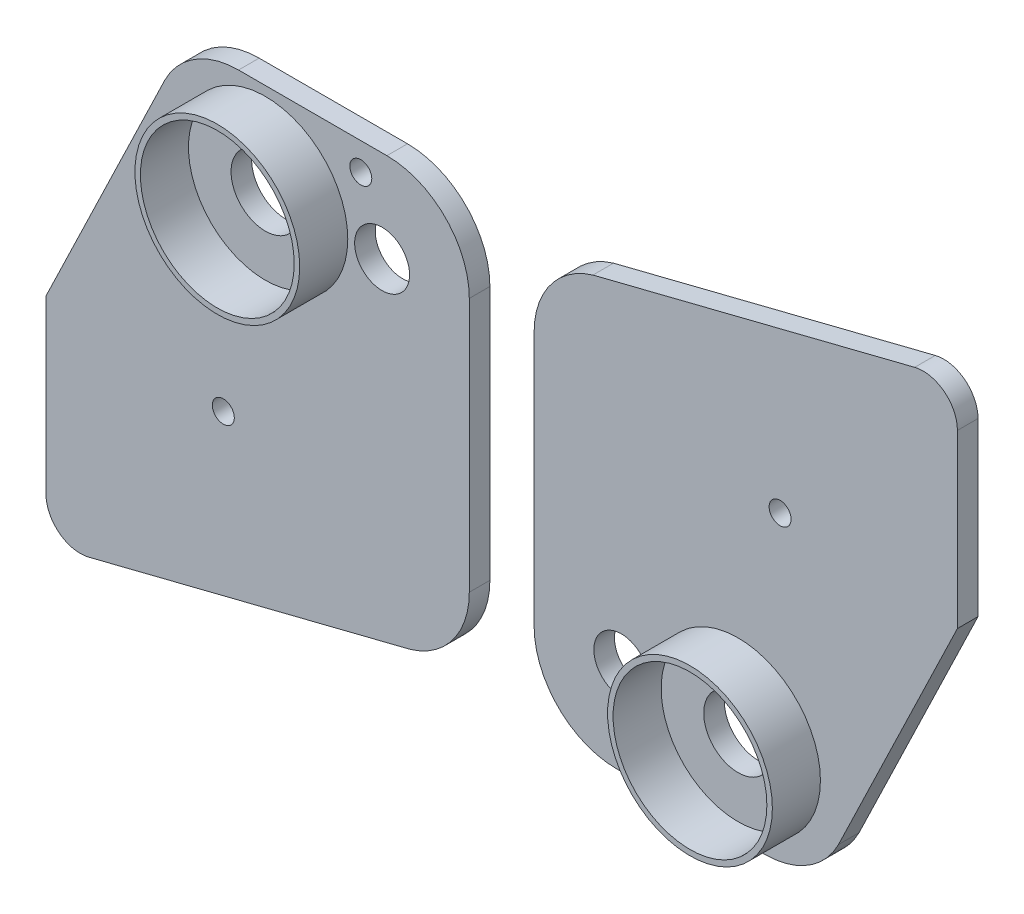
ISO-10303-21;
HEADER;
FILE_DESCRIPTION(('STEP AP214'),'2;1');
FILE_NAME('part.step','',(''),(''),'','','');
FILE_SCHEMA(('AUTOMOTIVE_DESIGN { 1 0 10303 214 1 1 1 1 }'));
ENDSEC;
DATA;
#1=APPLICATION_CONTEXT('core data for automotive mechanical design processes');
#2=APPLICATION_PROTOCOL_DEFINITION('international standard','automotive_design',2000,#1);
#3=PRODUCT_CONTEXT('',#1,'mechanical');
#4=PRODUCT('Part','Part','',(#3));
#5=PRODUCT_RELATED_PRODUCT_CATEGORY('part','',(#4));
#6=PRODUCT_DEFINITION_FORMATION('','',#4);
#7=PRODUCT_DEFINITION_CONTEXT('part definition',#1,'design');
#8=PRODUCT_DEFINITION('design','',#6,#7);
#9=PRODUCT_DEFINITION_SHAPE('','',#8);
#10=(LENGTH_UNIT() NAMED_UNIT(*) SI_UNIT(.MILLI.,.METRE.));
#11=(NAMED_UNIT(*) PLANE_ANGLE_UNIT() SI_UNIT($,.RADIAN.));
#12=(NAMED_UNIT(*) SI_UNIT($,.STERADIAN.) SOLID_ANGLE_UNIT());
#13=UNCERTAINTY_MEASURE_WITH_UNIT(LENGTH_MEASURE(1.E-05),#10,'distance_accuracy_value','');
#14=(GEOMETRIC_REPRESENTATION_CONTEXT(3) GLOBAL_UNCERTAINTY_ASSIGNED_CONTEXT((#13)) GLOBAL_UNIT_ASSIGNED_CONTEXT((#10,
#11,#12)) REPRESENTATION_CONTEXT('',''));
#15=CARTESIAN_POINT('',(0.,0.,0.));
#16=DIRECTION('',(0.,0.,1.));
#17=DIRECTION('',(1.,0.,0.));
#18=AXIS2_PLACEMENT_3D('',#15,#16,#17);
#19=CARTESIAN_POINT('',(377.739863494264,199.097061175407,3.));
#20=DIRECTION('',(0.,0.,1.));
#21=DIRECTION('',(1.,0.,0.));
#22=AXIS2_PLACEMENT_3D('',#19,#20,#21);
#23=PLANE('',#22);
#24=CARTESIAN_POINT('',(395.439813655086,163.405787794351,3.));
#25=DIRECTION('',(0.,0.,1.));
#26=DIRECTION('',(1.,0.,0.));
#27=AXIS2_PLACEMENT_3D('',#24,#25,#26);
#28=CIRCLE('',#27,5.);
#29=CARTESIAN_POINT('',(400.439813655086,163.405787794351,3.));
#30=VERTEX_POINT('',#29);
#31=EDGE_CURVE('E165',#30,#30,#28,.T.);
#32=ORIENTED_EDGE('',*,*,#31,.F.);
#33=EDGE_LOOP('',(#32));
#34=FACE_BOUND('',#33,.T.);
#35=CARTESIAN_POINT('',(395.439813655086,163.405787794351,3.));
#36=DIRECTION('',(0.,0.,1.));
#37=DIRECTION('',(1.,0.,0.));
#38=AXIS2_PLACEMENT_3D('',#35,#36,#37);
#39=CIRCLE('',#38,11.2);
#40=CARTESIAN_POINT('',(406.639813655086,163.405787794351,3.));
#41=VERTEX_POINT('',#40);
#42=EDGE_CURVE('E12',#41,#41,#39,.F.);
#43=ORIENTED_EDGE('',*,*,#42,.F.);
#44=EDGE_LOOP('',(#43));
#45=FACE_BOUND('',#44,.T.);
#46=ADVANCED_FACE('F49',(#34,#45),#23,.T.);
#47=CARTESIAN_POINT('',(381.543175650086,154.035452128009,3.));
#48=DIRECTION('',(0.,0.,1.));
#49=DIRECTION('',(1.,0.,0.));
#50=AXIS2_PLACEMENT_3D('',#47,#48,#49);
#51=CIRCLE('',#50,1.59999999999996);
#52=CARTESIAN_POINT('',(383.143175650086,154.035452128009,3.));
#53=VERTEX_POINT('',#52);
#54=EDGE_CURVE('E411',#53,#53,#51,.T.);
#55=ORIENTED_EDGE('',*,*,#54,.F.);
#56=EDGE_LOOP('',(#55));
#57=FACE_BOUND('',#56,.T.);
#58=CARTESIAN_POINT('',(395.439813655086,163.405787794351,3.));
#59=DIRECTION('',(0.,0.,1.));
#60=DIRECTION('',(1.,0.,0.));
#61=AXIS2_PLACEMENT_3D('',#58,#59,#60);
#62=CIRCLE('',#61,12.);
#63=CARTESIAN_POINT('',(407.439813655086,163.405787794351,3.));
#64=VERTEX_POINT('',#63);
#65=EDGE_CURVE('E416',#64,#64,#62,.T.);
#66=ORIENTED_EDGE('',*,*,#65,.F.);
#67=EDGE_LOOP('',(#66));
#68=FACE_BOUND('',#67,.T.);
#69=CARTESIAN_POINT('',(378.439815150086,163.409889395351,3.));
#70=DIRECTION('',(0.,0.,1.));
#71=DIRECTION('',(1.,0.,0.));
#72=AXIS2_PLACEMENT_3D('',#69,#70,#71);
#73=CIRCLE('',#72,4.);
#74=CARTESIAN_POINT('',(382.439815150086,163.409889395351,3.));
#75=VERTEX_POINT('',#74);
#76=EDGE_CURVE('E432',#75,#75,#73,.T.);
#77=ORIENTED_EDGE('',*,*,#76,.F.);
#78=EDGE_LOOP('',(#77));
#79=FACE_BOUND('',#78,.T.);
#80=CARTESIAN_POINT('',(377.739863494264,199.097061175407,3.));
#81=DIRECTION('',(0.,0.,1.));
#82=DIRECTION('',(1.,0.,0.));
#83=AXIS2_PLACEMENT_3D('',#80,#81,#82);
#84=CIRCLE('',#83,12.);
#85=CARTESIAN_POINT('',(374.304233938086,210.594732659352,3.));
#86=VERTEX_POINT('',#85);
#87=CARTESIAN_POINT('',(365.739863495086,199.097201598351,3.));
#88=VERTEX_POINT('',#87);
#89=EDGE_CURVE('E180',#86,#88,#84,.T.);
#90=ORIENTED_EDGE('',*,*,#89,.T.);
#91=DIRECTION('',(-1.1989243278738E-05,-0.999999999928129,0.));
#92=VECTOR('',#91,1.);
#93=CARTESIAN_POINT('',(365.739863495086,199.097201598351,3.));
#94=LINE('',#93,#92);
#95=CARTESIAN_POINT('',(365.739785625086,192.560881428352,3.));
#96=VERTEX_POINT('',#95);
#97=EDGE_CURVE('E117',#88,#96,#94,.T.);
#98=ORIENTED_EDGE('',*,*,#97,.T.);
#99=DIRECTION('',(-1.18627733119877E-05,-0.999999999929637,0.));
#100=VECTOR('',#99,1.);
#101=CARTESIAN_POINT('',(365.739785625086,192.560881428352,3.));
#102=LINE('',#101,#100);
#103=CARTESIAN_POINT('',(365.739423511086,162.035641633352,3.));
#104=VERTEX_POINT('',#103);
#105=EDGE_CURVE('E215',#96,#104,#102,.T.);
#106=ORIENTED_EDGE('',*,*,#105,.T.);
#107=CARTESIAN_POINT('',(377.739416510132,162.035490368515,3.));
#108=DIRECTION('',(0.,0.,1.));
#109=DIRECTION('',(1.,0.,0.));
#110=AXIS2_PLACEMENT_3D('',#107,#108,#109);
#111=CIRCLE('',#110,11.999993);
#112=CARTESIAN_POINT('',(377.739274869086,150.035497369351,3.));
#113=VERTEX_POINT('',#112);
#114=EDGE_CURVE('E212',#104,#113,#111,.T.);
#115=ORIENTED_EDGE('',*,*,#114,.T.);
#116=DIRECTION('',(0.999999999929273,-1.18934820438512E-05,0.));
#117=VECTOR('',#116,1.);
#118=CARTESIAN_POINT('',(377.739274869086,150.035497369351,3.));
#119=LINE('',#118,#117);
#120=CARTESIAN_POINT('',(399.347076431086,150.035240377352,3.));
#121=VERTEX_POINT('',#120);
#122=EDGE_CURVE('E214',#113,#121,#119,.T.);
#123=ORIENTED_EDGE('',*,*,#122,.T.);
#124=CARTESIAN_POINT('',(399.34721242908,162.035241376581,3.));
#125=DIRECTION('',(0.,0.,1.));
#126=DIRECTION('',(1.,0.,0.));
#127=AXIS2_PLACEMENT_3D('',#124,#125,#126);
#128=CIRCLE('',#127,12.000001);
#129=CARTESIAN_POINT('',(410.064546388086,156.637206844351,3.));
#130=VERTEX_POINT('',#129);
#131=EDGE_CURVE('E217',#121,#130,#128,.T.);
#132=ORIENTED_EDGE('',*,*,#131,.T.);
#133=DIRECTION('',(0.434503028481842,0.900670371578919,0.));
#134=VECTOR('',#133,1.);
#135=CARTESIAN_POINT('',(410.064546388086,156.637206844351,3.));
#136=LINE('',#135,#134);
#137=CARTESIAN_POINT('',(427.388642283086,192.547888391352,3.));
#138=VERTEX_POINT('',#137);
#139=EDGE_CURVE('E143',#130,#138,#136,.T.);
#140=ORIENTED_EDGE('',*,*,#139,.T.);
#141=DIRECTION('',(0.,1.,0.));
#142=VECTOR('',#141,1.);
#143=CARTESIAN_POINT('',(427.388642283086,192.547888391352,3.));
#144=LINE('',#143,#142);
#145=CARTESIAN_POINT('',(427.388642283086,217.538315941336,3.));
#146=VERTEX_POINT('',#145);
#147=EDGE_CURVE('E136',#138,#146,#144,.T.);
#148=ORIENTED_EDGE('',*,*,#147,.T.);
#149=CARTESIAN_POINT('',(422.388642283086,217.538315941336,3.));
#150=DIRECTION('',(0.,0.,1.));
#151=DIRECTION('',(1.,0.,0.));
#152=AXIS2_PLACEMENT_3D('',#149,#150,#151);
#153=CIRCLE('',#152,5.00000000000001);
#154=CARTESIAN_POINT('',(421.168529959641,222.387163837299,3.));
#155=VERTEX_POINT('',#154);
#156=EDGE_CURVE('E141',#146,#155,#153,.T.);
#157=ORIENTED_EDGE('',*,*,#156,.T.);
#158=DIRECTION('',(-0.969769579192457,-0.244022464688982,0.));
#159=VECTOR('',#158,1.);
#160=CARTESIAN_POINT('',(421.168529959641,222.387163837299,3.));
#161=LINE('',#160,#159);
#162=EDGE_CURVE('E67',#155,#86,#161,.T.);
#163=ORIENTED_EDGE('',*,*,#162,.T.);
#164=EDGE_LOOP('',(#90,#98,#106,#115,#123,#132,#140,#148,#157,#163));
#165=FACE_BOUND('',#164,.T.);
#166=CARTESIAN_POINT('',(401.564798043086,194.210214669352,3.));
#167=DIRECTION('',(0.,0.,1.));
#168=DIRECTION('',(1.,0.,0.));
#169=AXIS2_PLACEMENT_3D('',#166,#167,#168);
#170=CIRCLE('',#169,1.59999999999999);
#171=CARTESIAN_POINT('',(403.164798043086,194.210214669352,3.));
#172=VERTEX_POINT('',#171);
#173=EDGE_CURVE('E426',#172,#172,#170,.T.);
#174=ORIENTED_EDGE('',*,*,#173,.F.);
#175=EDGE_LOOP('',(#174));
#176=FACE_BOUND('',#175,.T.);
#177=ADVANCED_FACE('F138',(#57,#68,#79,#165,#176),#23,.T.);
#178=CARTESIAN_POINT('',(377.739863494264,199.097061175407,0.));
#179=DIRECTION('',(0.,0.,1.));
#180=DIRECTION('',(1.,0.,0.));
#181=AXIS2_PLACEMENT_3D('',#178,#179,#180);
#182=PLANE('',#181);
#183=CARTESIAN_POINT('',(381.543175650086,154.035452128009,0.));
#184=DIRECTION('',(0.,0.,1.));
#185=DIRECTION('',(1.,0.,0.));
#186=AXIS2_PLACEMENT_3D('',#183,#184,#185);
#187=CIRCLE('',#186,1.59999999999996);
#188=CARTESIAN_POINT('',(383.143175650086,154.035452128009,0.));
#189=VERTEX_POINT('',#188);
#190=EDGE_CURVE('E53',#189,#189,#187,.T.);
#191=ORIENTED_EDGE('',*,*,#190,.T.);
#192=EDGE_LOOP('',(#191));
#193=FACE_BOUND('',#192,.T.);
#194=CARTESIAN_POINT('',(377.739863494264,199.097061175407,0.));
#195=DIRECTION('',(0.,0.,1.));
#196=DIRECTION('',(1.,0.,0.));
#197=AXIS2_PLACEMENT_3D('',#194,#195,#196);
#198=CIRCLE('',#197,12.);
#199=CARTESIAN_POINT('',(374.304233938086,210.594732659352,0.));
#200=VERTEX_POINT('',#199);
#201=CARTESIAN_POINT('',(365.739863495086,199.097201598351,0.));
#202=VERTEX_POINT('',#201);
#203=EDGE_CURVE('E161',#200,#202,#198,.T.);
#204=ORIENTED_EDGE('',*,*,#203,.F.);
#205=DIRECTION('',(-0.969769579192457,-0.244022464688982,0.));
#206=VECTOR('',#205,1.);
#207=CARTESIAN_POINT('',(421.168529959641,222.387163837299,0.));
#208=LINE('',#207,#206);
#209=CARTESIAN_POINT('',(421.168529959641,222.387163837299,0.));
#210=VERTEX_POINT('',#209);
#211=EDGE_CURVE('E108',#210,#200,#208,.T.);
#212=ORIENTED_EDGE('',*,*,#211,.F.);
#213=CARTESIAN_POINT('',(422.388642283086,217.538315941336,0.));
#214=DIRECTION('',(0.,0.,1.));
#215=DIRECTION('',(1.,0.,0.));
#216=AXIS2_PLACEMENT_3D('',#213,#214,#215);
#217=CIRCLE('',#216,5.00000000000001);
#218=CARTESIAN_POINT('',(427.388642283086,217.538315941336,0.));
#219=VERTEX_POINT('',#218);
#220=EDGE_CURVE('E102',#219,#210,#217,.T.);
#221=ORIENTED_EDGE('',*,*,#220,.F.);
#222=DIRECTION('',(0.,1.,0.));
#223=VECTOR('',#222,1.);
#224=CARTESIAN_POINT('',(427.388642283086,192.547888391352,0.));
#225=LINE('',#224,#223);
#226=CARTESIAN_POINT('',(427.388642283086,192.547888391352,0.));
#227=VERTEX_POINT('',#226);
#228=EDGE_CURVE('E151',#227,#219,#225,.T.);
#229=ORIENTED_EDGE('',*,*,#228,.F.);
#230=DIRECTION('',(0.434503028481842,0.900670371578919,0.));
#231=VECTOR('',#230,1.);
#232=CARTESIAN_POINT('',(410.064546388086,156.637206844351,0.));
#233=LINE('',#232,#231);
#234=CARTESIAN_POINT('',(410.064546388086,156.637206844351,0.));
#235=VERTEX_POINT('',#234);
#236=EDGE_CURVE('E175',#235,#227,#233,.T.);
#237=ORIENTED_EDGE('',*,*,#236,.F.);
#238=CARTESIAN_POINT('',(399.34721242908,162.035241376581,0.));
#239=DIRECTION('',(0.,0.,1.));
#240=DIRECTION('',(1.,0.,0.));
#241=AXIS2_PLACEMENT_3D('',#238,#239,#240);
#242=CIRCLE('',#241,12.000001);
#243=CARTESIAN_POINT('',(399.347076431086,150.035240377352,0.));
#244=VERTEX_POINT('',#243);
#245=EDGE_CURVE('E173',#244,#235,#242,.T.);
#246=ORIENTED_EDGE('',*,*,#245,.F.);
#247=DIRECTION('',(0.999999999929273,-1.18934820438512E-05,0.));
#248=VECTOR('',#247,1.);
#249=CARTESIAN_POINT('',(377.739274869086,150.035497369351,0.));
#250=LINE('',#249,#248);
#251=CARTESIAN_POINT('',(377.739274869086,150.035497369351,0.));
#252=VERTEX_POINT('',#251);
#253=EDGE_CURVE('E171',#252,#244,#250,.T.);
#254=ORIENTED_EDGE('',*,*,#253,.F.);
#255=CARTESIAN_POINT('',(377.739416510132,162.035490368515,0.));
#256=DIRECTION('',(0.,0.,1.));
#257=DIRECTION('',(1.,0.,0.));
#258=AXIS2_PLACEMENT_3D('',#255,#256,#257);
#259=CIRCLE('',#258,11.999993);
#260=CARTESIAN_POINT('',(365.739423511086,162.035641633352,0.));
#261=VERTEX_POINT('',#260);
#262=EDGE_CURVE('E169',#261,#252,#259,.T.);
#263=ORIENTED_EDGE('',*,*,#262,.F.);
#264=DIRECTION('',(-1.18627733119877E-05,-0.999999999929637,0.));
#265=VECTOR('',#264,1.);
#266=CARTESIAN_POINT('',(365.739785625086,192.560881428352,0.));
#267=LINE('',#266,#265);
#268=CARTESIAN_POINT('',(365.739785625086,192.560881428352,0.));
#269=VERTEX_POINT('',#268);
#270=EDGE_CURVE('E167',#269,#261,#267,.T.);
#271=ORIENTED_EDGE('',*,*,#270,.F.);
#272=DIRECTION('',(-1.18390781991546E-05,-0.999999999929918,0.));
#273=VECTOR('',#272,1.);
#274=CARTESIAN_POINT('',(365.739824693086,195.860800514351,0.));
#275=LINE('',#274,#273);
#276=EDGE_CURVE('E164',#202,#269,#275,.T.);
#277=ORIENTED_EDGE('',*,*,#276,.F.);
#278=EDGE_LOOP('',(#204,#212,#221,#229,#237,#246,#254,#263,#271,#277));
#279=FACE_BOUND('',#278,.T.);
#280=CARTESIAN_POINT('',(395.439813655086,163.405787794351,0.));
#281=DIRECTION('',(0.,0.,1.));
#282=DIRECTION('',(1.,0.,0.));
#283=AXIS2_PLACEMENT_3D('',#280,#281,#282);
#284=CIRCLE('',#283,5.);
#285=CARTESIAN_POINT('',(400.439813655086,163.405787794351,0.));
#286=VERTEX_POINT('',#285);
#287=EDGE_CURVE('E435',#286,#286,#284,.T.);
#288=ORIENTED_EDGE('',*,*,#287,.T.);
#289=EDGE_LOOP('',(#288));
#290=FACE_BOUND('',#289,.T.);
#291=CARTESIAN_POINT('',(378.439815150086,163.409889395351,0.));
#292=DIRECTION('',(0.,0.,1.));
#293=DIRECTION('',(1.,0.,0.));
#294=AXIS2_PLACEMENT_3D('',#291,#292,#293);
#295=CIRCLE('',#294,4.);
#296=CARTESIAN_POINT('',(382.439815150086,163.409889395351,0.));
#297=VERTEX_POINT('',#296);
#298=EDGE_CURVE('E429',#297,#297,#295,.T.);
#299=ORIENTED_EDGE('',*,*,#298,.T.);
#300=EDGE_LOOP('',(#299));
#301=FACE_BOUND('',#300,.T.);
#302=CARTESIAN_POINT('',(401.564798043086,194.210214669352,0.));
#303=DIRECTION('',(0.,0.,1.));
#304=DIRECTION('',(1.,0.,0.));
#305=AXIS2_PLACEMENT_3D('',#302,#303,#304);
#306=CIRCLE('',#305,1.59999999999999);
#307=CARTESIAN_POINT('',(403.164798043086,194.210214669352,0.));
#308=VERTEX_POINT('',#307);
#309=EDGE_CURVE('E423',#308,#308,#306,.T.);
#310=ORIENTED_EDGE('',*,*,#309,.T.);
#311=EDGE_LOOP('',(#310));
#312=FACE_BOUND('',#311,.T.);
#313=ADVANCED_FACE('F203',(#193,#279,#290,#301,#312),#182,.F.);
#314=CARTESIAN_POINT('',(377.739863494264,199.097061175407,3.));
#315=DIRECTION('',(0.,0.,-1.));
#316=DIRECTION('',(-1.,0.,0.));
#317=AXIS2_PLACEMENT_3D('',#314,#315,#316);
#318=CYLINDRICAL_SURFACE('',#317,12.);
#319=ORIENTED_EDGE('',*,*,#203,.T.);
#320=DIRECTION('',(0.,0.,-1.));
#321=VECTOR('',#320,1.);
#322=CARTESIAN_POINT('',(365.739863495086,199.097201598351,3.));
#323=LINE('',#322,#321);
#324=EDGE_CURVE('E59',#88,#202,#323,.T.);
#325=ORIENTED_EDGE('',*,*,#324,.F.);
#326=ORIENTED_EDGE('',*,*,#89,.F.);
#327=DIRECTION('',(0.,0.,-1.));
#328=VECTOR('',#327,1.);
#329=CARTESIAN_POINT('',(374.304233938086,210.594732659352,3.));
#330=LINE('',#329,#328);
#331=EDGE_CURVE('E157',#86,#200,#330,.T.);
#332=ORIENTED_EDGE('',*,*,#331,.T.);
#333=EDGE_LOOP('',(#319,#325,#326,#332));
#334=FACE_BOUND('',#333,.T.);
#335=ADVANCED_FACE('F51',(#334),#318,.T.);
#336=CARTESIAN_POINT('',(365.739785625086,192.560881428352,3.));
#337=DIRECTION('',(0.999999999929637,-1.18627733119877E-05,0.));
#338=DIRECTION('',(1.18627733119877E-05,0.999999999929637,0.));
#339=AXIS2_PLACEMENT_3D('',#336,#337,#338);
#340=PLANE('',#339);
#341=ORIENTED_EDGE('',*,*,#270,.T.);
#342=DIRECTION('',(0.,0.,-1.));
#343=VECTOR('',#342,1.);
#344=CARTESIAN_POINT('',(365.739423511086,162.035641633352,3.));
#345=LINE('',#344,#343);
#346=EDGE_CURVE('E193',#104,#261,#345,.T.);
#347=ORIENTED_EDGE('',*,*,#346,.F.);
#348=ORIENTED_EDGE('',*,*,#105,.F.);
#349=ORIENTED_EDGE('',*,*,#97,.F.);
#350=ORIENTED_EDGE('',*,*,#324,.T.);
#351=ORIENTED_EDGE('',*,*,#276,.T.);
#352=EDGE_LOOP('',(#341,#347,#348,#349,#350,#351));
#353=FACE_BOUND('',#352,.T.);
#354=ADVANCED_FACE('F197',(#353),#340,.F.);
#355=CARTESIAN_POINT('',(377.739416510132,162.035490368515,3.));
#356=DIRECTION('',(0.,0.,-1.));
#357=DIRECTION('',(-1.,0.,0.));
#358=AXIS2_PLACEMENT_3D('',#355,#356,#357);
#359=CYLINDRICAL_SURFACE('',#358,11.999993);
#360=ORIENTED_EDGE('',*,*,#262,.T.);
#361=DIRECTION('',(0.,0.,-1.));
#362=VECTOR('',#361,1.);
#363=CARTESIAN_POINT('',(377.739274869086,150.035497369351,3.));
#364=LINE('',#363,#362);
#365=EDGE_CURVE('E190',#113,#252,#364,.T.);
#366=ORIENTED_EDGE('',*,*,#365,.F.);
#367=ORIENTED_EDGE('',*,*,#114,.F.);
#368=ORIENTED_EDGE('',*,*,#346,.T.);
#369=EDGE_LOOP('',(#360,#366,#367,#368));
#370=FACE_BOUND('',#369,.T.);
#371=ADVANCED_FACE('F210',(#370),#359,.T.);
#372=CARTESIAN_POINT('',(377.739274869086,150.035497369351,3.));
#373=DIRECTION('',(1.18934820438512E-05,0.999999999929272,0.));
#374=DIRECTION('',(-0.999999999929273,1.18934820438512E-05,0.));
#375=AXIS2_PLACEMENT_3D('',#372,#373,#374);
#376=PLANE('',#375);
#377=ORIENTED_EDGE('',*,*,#253,.T.);
#378=DIRECTION('',(0.,0.,-1.));
#379=VECTOR('',#378,1.);
#380=CARTESIAN_POINT('',(399.347076431086,150.035240377352,3.));
#381=LINE('',#380,#379);
#382=EDGE_CURVE('E187',#121,#244,#381,.T.);
#383=ORIENTED_EDGE('',*,*,#382,.F.);
#384=ORIENTED_EDGE('',*,*,#122,.F.);
#385=ORIENTED_EDGE('',*,*,#365,.T.);
#386=EDGE_LOOP('',(#377,#383,#384,#385));
#387=FACE_BOUND('',#386,.T.);
#388=ADVANCED_FACE('F232',(#387),#376,.F.);
#389=CARTESIAN_POINT('',(399.34721242908,162.035241376581,3.));
#390=DIRECTION('',(0.,0.,-1.));
#391=DIRECTION('',(-1.,0.,0.));
#392=AXIS2_PLACEMENT_3D('',#389,#390,#391);
#393=CYLINDRICAL_SURFACE('',#392,12.000001);
#394=ORIENTED_EDGE('',*,*,#245,.T.);
#395=DIRECTION('',(0.,0.,-1.));
#396=VECTOR('',#395,1.);
#397=CARTESIAN_POINT('',(410.064546388086,156.637206844351,3.));
#398=LINE('',#397,#396);
#399=EDGE_CURVE('E184',#130,#235,#398,.T.);
#400=ORIENTED_EDGE('',*,*,#399,.F.);
#401=ORIENTED_EDGE('',*,*,#131,.F.);
#402=ORIENTED_EDGE('',*,*,#382,.T.);
#403=EDGE_LOOP('',(#394,#400,#401,#402));
#404=FACE_BOUND('',#403,.T.);
#405=ADVANCED_FACE('F226',(#404),#393,.T.);
#406=CARTESIAN_POINT('',(410.064546388086,156.637206844351,3.));
#407=DIRECTION('',(-0.900670371578919,0.434503028481842,0.));
#408=DIRECTION('',(-0.434503028481842,-0.900670371578919,0.));
#409=AXIS2_PLACEMENT_3D('',#406,#407,#408);
#410=PLANE('',#409);
#411=ORIENTED_EDGE('',*,*,#236,.T.);
#412=DIRECTION('',(0.,0.,-1.));
#413=VECTOR('',#412,1.);
#414=CARTESIAN_POINT('',(427.388642283086,192.547888391352,3.));
#415=LINE('',#414,#413);
#416=EDGE_CURVE('E152',#138,#227,#415,.T.);
#417=ORIENTED_EDGE('',*,*,#416,.F.);
#418=ORIENTED_EDGE('',*,*,#139,.F.);
#419=ORIENTED_EDGE('',*,*,#399,.T.);
#420=EDGE_LOOP('',(#411,#417,#418,#419));
#421=FACE_BOUND('',#420,.T.);
#422=ADVANCED_FACE('F230',(#421),#410,.F.);
#423=CARTESIAN_POINT('',(427.388642283086,192.547888391352,3.));
#424=DIRECTION('',(-1.,0.,0.));
#425=DIRECTION('',(0.,0.,1.));
#426=AXIS2_PLACEMENT_3D('',#423,#424,#425);
#427=PLANE('',#426);
#428=ORIENTED_EDGE('',*,*,#228,.T.);
#429=DIRECTION('',(0.,0.,-1.));
#430=VECTOR('',#429,1.);
#431=CARTESIAN_POINT('',(427.388642283086,217.538315941336,3.));
#432=LINE('',#431,#430);
#433=EDGE_CURVE('E148',#146,#219,#432,.T.);
#434=ORIENTED_EDGE('',*,*,#433,.F.);
#435=ORIENTED_EDGE('',*,*,#147,.F.);
#436=ORIENTED_EDGE('',*,*,#416,.T.);
#437=EDGE_LOOP('',(#428,#434,#435,#436));
#438=FACE_BOUND('',#437,.T.);
#439=ADVANCED_FACE('F149',(#438),#427,.F.);
#440=CARTESIAN_POINT('',(422.388642283086,217.538315941336,3.));
#441=DIRECTION('',(0.,0.,-1.));
#442=DIRECTION('',(-1.,0.,0.));
#443=AXIS2_PLACEMENT_3D('',#440,#441,#442);
#444=CYLINDRICAL_SURFACE('',#443,5.00000000000001);
#445=ORIENTED_EDGE('',*,*,#220,.T.);
#446=DIRECTION('',(0.,0.,-1.));
#447=VECTOR('',#446,1.);
#448=CARTESIAN_POINT('',(421.168529959641,222.387163837299,3.));
#449=LINE('',#448,#447);
#450=EDGE_CURVE('E153',#155,#210,#449,.T.);
#451=ORIENTED_EDGE('',*,*,#450,.F.);
#452=ORIENTED_EDGE('',*,*,#156,.F.);
#453=ORIENTED_EDGE('',*,*,#433,.T.);
#454=EDGE_LOOP('',(#445,#451,#452,#453));
#455=FACE_BOUND('',#454,.T.);
#456=ADVANCED_FACE('F155',(#455),#444,.T.);
#457=CARTESIAN_POINT('',(421.168529959641,222.387163837299,3.));
#458=DIRECTION('',(0.244022464688982,-0.969769579192457,0.));
#459=DIRECTION('',(0.969769579192457,0.244022464688982,0.));
#460=AXIS2_PLACEMENT_3D('',#457,#458,#459);
#461=PLANE('',#460);
#462=ORIENTED_EDGE('',*,*,#211,.T.);
#463=ORIENTED_EDGE('',*,*,#331,.F.);
#464=ORIENTED_EDGE('',*,*,#162,.F.);
#465=ORIENTED_EDGE('',*,*,#450,.T.);
#466=EDGE_LOOP('',(#462,#463,#464,#465));
#467=FACE_BOUND('',#466,.T.);
#468=ADVANCED_FACE('F257',(#467),#461,.F.);
#469=CARTESIAN_POINT('',(395.439813655086,163.405787794351,3.));
#470=DIRECTION('',(0.,0.,-1.));
#471=DIRECTION('',(-1.,0.,0.));
#472=AXIS2_PLACEMENT_3D('',#469,#470,#471);
#473=CYLINDRICAL_SURFACE('',#472,5.);
#474=ORIENTED_EDGE('',*,*,#31,.T.);
#475=EDGE_LOOP('',(#474));
#476=FACE_BOUND('',#475,.T.);
#477=ORIENTED_EDGE('',*,*,#287,.F.);
#478=EDGE_LOOP('',(#477));
#479=FACE_BOUND('',#478,.T.);
#480=ADVANCED_FACE('F252',(#476,#479),#473,.F.);
#481=CARTESIAN_POINT('',(378.439815150086,163.409889395351,3.));
#482=DIRECTION('',(0.,0.,-1.));
#483=DIRECTION('',(-1.,0.,0.));
#484=AXIS2_PLACEMENT_3D('',#481,#482,#483);
#485=CYLINDRICAL_SURFACE('',#484,4.);
#486=ORIENTED_EDGE('',*,*,#76,.T.);
#487=EDGE_LOOP('',(#486));
#488=FACE_BOUND('',#487,.T.);
#489=ORIENTED_EDGE('',*,*,#298,.F.);
#490=EDGE_LOOP('',(#489));
#491=FACE_BOUND('',#490,.T.);
#492=ADVANCED_FACE('F287',(#488,#491),#485,.F.);
#493=CARTESIAN_POINT('',(401.564798043086,194.210214669352,3.));
#494=DIRECTION('',(0.,0.,-1.));
#495=DIRECTION('',(-1.,0.,0.));
#496=AXIS2_PLACEMENT_3D('',#493,#494,#495);
#497=CYLINDRICAL_SURFACE('',#496,1.59999999999999);
#498=ORIENTED_EDGE('',*,*,#173,.T.);
#499=EDGE_LOOP('',(#498));
#500=FACE_BOUND('',#499,.T.);
#501=ORIENTED_EDGE('',*,*,#309,.F.);
#502=EDGE_LOOP('',(#501));
#503=FACE_BOUND('',#502,.T.);
#504=ADVANCED_FACE('F294',(#500,#503),#497,.F.);
#505=CARTESIAN_POINT('',(395.439813655086,163.405787794351,10.));
#506=DIRECTION('',(0.,0.,1.));
#507=DIRECTION('',(1.,0.,0.));
#508=AXIS2_PLACEMENT_3D('',#505,#506,#507);
#509=PLANE('',#508);
#510=CARTESIAN_POINT('',(395.439813655086,163.405787794351,10.));
#511=DIRECTION('',(0.,0.,1.));
#512=DIRECTION('',(1.,0.,0.));
#513=AXIS2_PLACEMENT_3D('',#510,#511,#512);
#514=CIRCLE('',#513,12.);
#515=CARTESIAN_POINT('',(407.439813655086,163.405787794351,10.));
#516=VERTEX_POINT('',#515);
#517=EDGE_CURVE('E420',#516,#516,#514,.T.);
#518=ORIENTED_EDGE('',*,*,#517,.T.);
#519=EDGE_LOOP('',(#518));
#520=FACE_BOUND('',#519,.T.);
#521=CARTESIAN_POINT('',(395.439813655086,163.405787794351,10.));
#522=DIRECTION('',(0.,0.,1.));
#523=DIRECTION('',(1.,0.,0.));
#524=AXIS2_PLACEMENT_3D('',#521,#522,#523);
#525=CIRCLE('',#524,11.2);
#526=CARTESIAN_POINT('',(406.639813655086,163.405787794351,10.));
#527=VERTEX_POINT('',#526);
#528=EDGE_CURVE('E414',#527,#527,#525,.T.);
#529=ORIENTED_EDGE('',*,*,#528,.F.);
#530=EDGE_LOOP('',(#529));
#531=FACE_BOUND('',#530,.T.);
#532=ADVANCED_FACE('F301',(#520,#531),#509,.T.);
#533=CARTESIAN_POINT('',(395.439813655086,163.405787794351,10.));
#534=DIRECTION('',(0.,0.,-1.));
#535=DIRECTION('',(-1.,0.,0.));
#536=AXIS2_PLACEMENT_3D('',#533,#534,#535);
#537=CYLINDRICAL_SURFACE('',#536,12.);
#538=ORIENTED_EDGE('',*,*,#517,.F.);
#539=EDGE_LOOP('',(#538));
#540=FACE_BOUND('',#539,.T.);
#541=ORIENTED_EDGE('',*,*,#65,.T.);
#542=EDGE_LOOP('',(#541));
#543=FACE_BOUND('',#542,.T.);
#544=ADVANCED_FACE('F309',(#540,#543),#537,.T.);
#545=CARTESIAN_POINT('',(395.439813655086,163.405787794351,10.));
#546=DIRECTION('',(0.,0.,-1.));
#547=DIRECTION('',(-1.,0.,0.));
#548=AXIS2_PLACEMENT_3D('',#545,#546,#547);
#549=CYLINDRICAL_SURFACE('',#548,11.2);
#550=ORIENTED_EDGE('',*,*,#528,.T.);
#551=EDGE_LOOP('',(#550));
#552=FACE_BOUND('',#551,.T.);
#553=ORIENTED_EDGE('',*,*,#42,.T.);
#554=EDGE_LOOP('',(#553));
#555=FACE_BOUND('',#554,.T.);
#556=ADVANCED_FACE('F317',(#552,#555),#549,.F.);
#557=CARTESIAN_POINT('',(381.543175650086,154.035452128009,-4.));
#558=DIRECTION('',(0.,0.,1.));
#559=DIRECTION('',(1.,0.,0.));
#560=AXIS2_PLACEMENT_3D('',#557,#558,#559);
#561=CYLINDRICAL_SURFACE('',#560,1.59999999999996);
#562=ORIENTED_EDGE('',*,*,#54,.T.);
#563=EDGE_LOOP('',(#562));
#564=FACE_BOUND('',#563,.T.);
#565=ORIENTED_EDGE('',*,*,#190,.F.);
#566=EDGE_LOOP('',(#565));
#567=FACE_BOUND('',#566,.T.);
#568=ADVANCED_FACE('F325',(#564,#567),#561,.F.);
#569=CLOSED_SHELL('',(#46,#177,#313,#335,#354,#371,#388,#405,#422,#439,#456,#468,#480,#492,#504,
#532,#544,#556,#568));
#570=MANIFOLD_SOLID_BREP('B2',#569);
#571=CARTESIAN_POINT('',(344.301679760779,161.586635809914,3.));
#572=DIRECTION('',(0.,0.,1.));
#573=DIRECTION('',(1.,0.,0.));
#574=AXIS2_PLACEMENT_3D('',#571,#572,#573);
#575=PLANE('',#574);
#576=CARTESIAN_POINT('',(326.601729599969,197.277910195181,3.));
#577=DIRECTION('',(0.,0.,1.));
#578=DIRECTION('',(1.,0.,0.));
#579=AXIS2_PLACEMENT_3D('',#576,#577,#578);
#580=CIRCLE('',#579,5.);
#581=CARTESIAN_POINT('',(331.601729599969,197.277910195181,3.));
#582=VERTEX_POINT('',#581);
#583=EDGE_CURVE('E586',#582,#582,#580,.T.);
#584=ORIENTED_EDGE('',*,*,#583,.F.);
#585=EDGE_LOOP('',(#584));
#586=FACE_BOUND('',#585,.T.);
#587=CARTESIAN_POINT('',(326.601729599969,197.277910195181,3.));
#588=DIRECTION('',(0.,0.,1.));
#589=DIRECTION('',(1.,0.,0.));
#590=AXIS2_PLACEMENT_3D('',#587,#588,#589);
#591=CIRCLE('',#590,11.2);
#592=CARTESIAN_POINT('',(337.801729599969,197.277910195181,3.));
#593=VERTEX_POINT('',#592);
#594=EDGE_CURVE('E47',#593,#593,#591,.F.);
#595=ORIENTED_EDGE('',*,*,#594,.F.);
#596=EDGE_LOOP('',(#595));
#597=FACE_BOUND('',#596,.T.);
#598=ADVANCED_FACE('F464',(#586,#597),#575,.T.);
#599=CARTESIAN_POINT('',(340.49836992437,206.64823678458,3.));
#600=DIRECTION('',(0.,0.,1.));
#601=DIRECTION('',(1.,0.,0.));
#602=AXIS2_PLACEMENT_3D('',#599,#600,#601);
#603=CIRCLE('',#602,1.59999999999996);
#604=CARTESIAN_POINT('',(342.09836992437,206.64823678458,3.));
#605=VERTEX_POINT('',#604);
#606=EDGE_CURVE('E851',#605,#605,#603,.T.);
#607=ORIENTED_EDGE('',*,*,#606,.F.);
#608=EDGE_LOOP('',(#607));
#609=FACE_BOUND('',#608,.T.);
#610=CARTESIAN_POINT('',(326.601729599969,197.277910195181,3.));
#611=DIRECTION('',(0.,0.,1.));
#612=DIRECTION('',(1.,0.,0.));
#613=AXIS2_PLACEMENT_3D('',#610,#611,#612);
#614=CIRCLE('',#613,12.);
#615=CARTESIAN_POINT('',(338.601729599969,197.277910195181,3.));
#616=VERTEX_POINT('',#615);
#617=EDGE_CURVE('E859',#616,#616,#614,.T.);
#618=ORIENTED_EDGE('',*,*,#617,.F.);
#619=EDGE_LOOP('',(#618));
#620=FACE_BOUND('',#619,.T.);
#621=CARTESIAN_POINT('',(343.601728104969,197.273808594181,3.));
#622=DIRECTION('',(0.,0.,1.));
#623=DIRECTION('',(1.,0.,0.));
#624=AXIS2_PLACEMENT_3D('',#621,#622,#623);
#625=CIRCLE('',#624,4.);
#626=CARTESIAN_POINT('',(347.601728104969,197.273808594181,3.));
#627=VERTEX_POINT('',#626);
#628=EDGE_CURVE('E879',#627,#627,#625,.T.);
#629=ORIENTED_EDGE('',*,*,#628,.F.);
#630=EDGE_LOOP('',(#629));
#631=FACE_BOUND('',#630,.T.);
#632=CARTESIAN_POINT('',(344.301679760779,161.586635809914,3.));
#633=DIRECTION('',(0.,0.,1.));
#634=DIRECTION('',(1.,0.,0.));
#635=AXIS2_PLACEMENT_3D('',#632,#633,#634);
#636=CIRCLE('',#635,12.);
#637=CARTESIAN_POINT('',(347.737310090131,150.088964557002,3.));
#638=VERTEX_POINT('',#637);
#639=CARTESIAN_POINT('',(356.301679759969,161.586496391181,3.));
#640=VERTEX_POINT('',#639);
#641=EDGE_CURVE('E610',#638,#640,#636,.T.);
#642=ORIENTED_EDGE('',*,*,#641,.T.);
#643=DIRECTION('',(1.19134311093094E-05,0.999999999929035,0.));
#644=VECTOR('',#643,1.);
#645=CARTESIAN_POINT('',(356.301757629969,168.122816561181,3.));
#646=LINE('',#645,#644);
#647=CARTESIAN_POINT('',(356.301757629969,168.122816561181,3.));
#648=VERTEX_POINT('',#647);
#649=EDGE_CURVE('E533',#640,#648,#646,.T.);
#650=ORIENTED_EDGE('',*,*,#649,.T.);
#651=DIRECTION('',(1.18627733138062E-05,0.999999999929637,0.));
#652=VECTOR('',#651,1.);
#653=CARTESIAN_POINT('',(356.301757629969,168.122816561181,3.));
#654=LINE('',#653,#652);
#655=CARTESIAN_POINT('',(356.30212051714,198.648056356172,3.));
#656=VERTEX_POINT('',#655);
#657=EDGE_CURVE('E654',#648,#656,#654,.T.);
#658=ORIENTED_EDGE('',*,*,#657,.T.);
#659=CARTESIAN_POINT('',(344.302129064333,198.648199317244,3.));
#660=DIRECTION('',(0.,0.,1.));
#661=DIRECTION('',(1.,0.,0.));
#662=AXIS2_PLACEMENT_3D('',#659,#660,#661);
#663=CIRCLE('',#662,11.9999914536586);
#664=CARTESIAN_POINT('',(344.30227070537,210.648191543237,3.));
#665=VERTEX_POINT('',#664);
#666=EDGE_CURVE('E650',#656,#665,#663,.T.);
#667=ORIENTED_EDGE('',*,*,#666,.T.);
#668=DIRECTION('',(-0.999999999929273,1.18934820464201E-05,0.));
#669=VECTOR('',#668,1.);
#670=CARTESIAN_POINT('',(344.30227070537,210.648191543237,3.));
#671=LINE('',#670,#669);
#672=CARTESIAN_POINT('',(322.69446914337,210.648448535237,3.));
#673=VERTEX_POINT('',#672);
#674=EDGE_CURVE('E653',#665,#673,#671,.T.);
#675=ORIENTED_EDGE('',*,*,#674,.T.);
#676=CARTESIAN_POINT('',(322.694327416782,198.648447536074,3.));
#677=DIRECTION('',(0.,0.,1.));
#678=DIRECTION('',(1.,0.,0.));
#679=AXIS2_PLACEMENT_3D('',#676,#677,#678);
#680=CIRCLE('',#679,12.000001);
#681=CARTESIAN_POINT('',(311.976997640131,204.046490372002,3.));
#682=VERTEX_POINT('',#681);
#683=EDGE_CURVE('E658',#673,#682,#680,.T.);
#684=ORIENTED_EDGE('',*,*,#683,.T.);
#685=DIRECTION('',(-0.434503028481843,-0.900670371578918,0.));
#686=VECTOR('',#685,1.);
#687=CARTESIAN_POINT('',(311.976997640131,204.046490372002,3.));
#688=LINE('',#687,#686);
#689=CARTESIAN_POINT('',(294.65290174513,168.135808825002,3.));
#690=VERTEX_POINT('',#689);
#691=EDGE_CURVE('E559',#682,#690,#688,.T.);
#692=ORIENTED_EDGE('',*,*,#691,.T.);
#693=DIRECTION('',(-1.99566968976717E-05,-0.999999999800865,0.));
#694=VECTOR('',#693,1.);
#695=CARTESIAN_POINT('',(294.65290174513,168.135808825002,3.));
#696=LINE('',#695,#694);
#697=CARTESIAN_POINT('',(294.652403018229,143.145355563937,3.));
#698=VERTEX_POINT('',#697);
#699=EDGE_CURVE('E552',#690,#698,#696,.T.);
#700=ORIENTED_EDGE('',*,*,#699,.T.);
#701=CARTESIAN_POINT('',(299.652403017234,143.145255780452,3.));
#702=DIRECTION('',(0.,0.,1.));
#703=DIRECTION('',(1.,0.,0.));
#704=AXIS2_PLACEMENT_3D('',#701,#702,#703);
#705=CIRCLE('',#704,5.00000000000005);
#706=CARTESIAN_POINT('',(300.872515340679,138.29640788449,3.));
#707=VERTEX_POINT('',#706);
#708=EDGE_CURVE('E557',#698,#707,#705,.T.);
#709=ORIENTED_EDGE('',*,*,#708,.T.);
#710=DIRECTION('',(0.969769579192456,0.244022464688983,0.));
#711=VECTOR('',#710,1.);
#712=CARTESIAN_POINT('',(300.872515340679,138.29640788449,3.));
#713=LINE('',#712,#711);
#714=EDGE_CURVE('E483',#707,#638,#713,.T.);
#715=ORIENTED_EDGE('',*,*,#714,.T.);
#716=EDGE_LOOP('',(#642,#650,#658,#667,#675,#684,#692,#700,#709,#715));
#717=FACE_BOUND('',#716,.T.);
#718=CARTESIAN_POINT('',(320.476745211969,166.473483320181,3.));
#719=DIRECTION('',(0.,0.,1.));
#720=DIRECTION('',(1.,0.,0.));
#721=AXIS2_PLACEMENT_3D('',#718,#719,#720);
#722=CIRCLE('',#721,1.59999999999999);
#723=CARTESIAN_POINT('',(322.076745211969,166.473483320181,3.));
#724=VERTEX_POINT('',#723);
#725=EDGE_CURVE('E871',#724,#724,#722,.T.);
#726=ORIENTED_EDGE('',*,*,#725,.F.);
#727=EDGE_LOOP('',(#726));
#728=FACE_BOUND('',#727,.T.);
#729=ADVANCED_FACE('F554',(#609,#620,#631,#717,#728),#575,.T.);
#730=CARTESIAN_POINT('',(344.301679760779,161.586635809914,0.));
#731=DIRECTION('',(0.,0.,1.));
#732=DIRECTION('',(1.,0.,0.));
#733=AXIS2_PLACEMENT_3D('',#730,#731,#732);
#734=PLANE('',#733);
#735=CARTESIAN_POINT('',(340.49836992437,206.64823678458,0.));
#736=DIRECTION('',(0.,0.,1.));
#737=DIRECTION('',(1.,0.,0.));
#738=AXIS2_PLACEMENT_3D('',#735,#736,#737);
#739=CIRCLE('',#738,1.59999999999996);
#740=CARTESIAN_POINT('',(342.09836992437,206.64823678458,0.));
#741=VERTEX_POINT('',#740);
#742=EDGE_CURVE('E468',#741,#741,#739,.T.);
#743=ORIENTED_EDGE('',*,*,#742,.T.);
#744=EDGE_LOOP('',(#743));
#745=FACE_BOUND('',#744,.T.);
#746=CARTESIAN_POINT('',(344.301679760779,161.586635809914,0.));
#747=DIRECTION('',(0.,0.,1.));
#748=DIRECTION('',(1.,0.,0.));
#749=AXIS2_PLACEMENT_3D('',#746,#747,#748);
#750=CIRCLE('',#749,12.);
#751=CARTESIAN_POINT('',(347.737310090131,150.088964557002,0.));
#752=VERTEX_POINT('',#751);
#753=CARTESIAN_POINT('',(356.301679759969,161.586496391181,0.));
#754=VERTEX_POINT('',#753);
#755=EDGE_CURVE('E581',#752,#754,#750,.T.);
#756=ORIENTED_EDGE('',*,*,#755,.F.);
#757=DIRECTION('',(0.969769579192456,0.244022464688983,0.));
#758=VECTOR('',#757,1.);
#759=CARTESIAN_POINT('',(300.872515340679,138.29640788449,0.));
#760=LINE('',#759,#758);
#761=CARTESIAN_POINT('',(300.872515340679,138.29640788449,0.));
#762=VERTEX_POINT('',#761);
#763=EDGE_CURVE('E524',#762,#752,#760,.T.);
#764=ORIENTED_EDGE('',*,*,#763,.F.);
#765=CARTESIAN_POINT('',(299.652403017234,143.145255780452,0.));
#766=DIRECTION('',(0.,0.,1.));
#767=DIRECTION('',(1.,0.,0.));
#768=AXIS2_PLACEMENT_3D('',#765,#766,#767);
#769=CIRCLE('',#768,5.00000000000005);
#770=CARTESIAN_POINT('',(294.652403018229,143.145355563937,0.));
#771=VERTEX_POINT('',#770);
#772=EDGE_CURVE('E518',#771,#762,#769,.T.);
#773=ORIENTED_EDGE('',*,*,#772,.F.);
#774=DIRECTION('',(-1.99566968976717E-05,-0.999999999800865,0.));
#775=VECTOR('',#774,1.);
#776=CARTESIAN_POINT('',(294.65290174513,168.135808825002,0.));
#777=LINE('',#776,#775);
#778=CARTESIAN_POINT('',(294.65290174513,168.135808825002,0.));
#779=VERTEX_POINT('',#778);
#780=EDGE_CURVE('E568',#779,#771,#777,.T.);
#781=ORIENTED_EDGE('',*,*,#780,.F.);
#782=DIRECTION('',(-0.434503028481843,-0.900670371578918,0.));
#783=VECTOR('',#782,1.);
#784=CARTESIAN_POINT('',(311.976997640131,204.046490372002,0.));
#785=LINE('',#784,#783);
#786=CARTESIAN_POINT('',(311.976997640131,204.046490372002,0.));
#787=VERTEX_POINT('',#786);
#788=EDGE_CURVE('E601',#787,#779,#785,.T.);
#789=ORIENTED_EDGE('',*,*,#788,.F.);
#790=CARTESIAN_POINT('',(322.694327416782,198.648447536074,0.));
#791=DIRECTION('',(0.,0.,1.));
#792=DIRECTION('',(1.,0.,0.));
#793=AXIS2_PLACEMENT_3D('',#790,#791,#792);
#794=CIRCLE('',#793,12.000001);
#795=CARTESIAN_POINT('',(322.69446914337,210.648448535237,0.));
#796=VERTEX_POINT('',#795);
#797=EDGE_CURVE('E598',#796,#787,#794,.T.);
#798=ORIENTED_EDGE('',*,*,#797,.F.);
#799=DIRECTION('',(-0.999999999929273,1.18934820464201E-05,0.));
#800=VECTOR('',#799,1.);
#801=CARTESIAN_POINT('',(344.30227070537,210.648191543237,0.));
#802=LINE('',#801,#800);
#803=CARTESIAN_POINT('',(344.30227070537,210.648191543237,0.));
#804=VERTEX_POINT('',#803);
#805=EDGE_CURVE('E595',#804,#796,#802,.T.);
#806=ORIENTED_EDGE('',*,*,#805,.F.);
#807=CARTESIAN_POINT('',(344.302129064333,198.648199317244,0.));
#808=DIRECTION('',(0.,0.,1.));
#809=DIRECTION('',(1.,0.,0.));
#810=AXIS2_PLACEMENT_3D('',#807,#808,#809);
#811=CIRCLE('',#810,11.9999914536586);
#812=CARTESIAN_POINT('',(356.30212051714,198.648056356172,0.));
#813=VERTEX_POINT('',#812);
#814=EDGE_CURVE('E592',#813,#804,#811,.T.);
#815=ORIENTED_EDGE('',*,*,#814,.F.);
#816=DIRECTION('',(1.18627733138062E-05,0.999999999929637,0.));
#817=VECTOR('',#816,1.);
#818=CARTESIAN_POINT('',(356.301757629969,168.122816561181,0.));
#819=LINE('',#818,#817);
#820=CARTESIAN_POINT('',(356.301757629969,168.122816561181,0.));
#821=VERTEX_POINT('',#820);
#822=EDGE_CURVE('E589',#821,#813,#819,.T.);
#823=ORIENTED_EDGE('',*,*,#822,.F.);
#824=DIRECTION('',(1.19134311093094E-05,0.999999999929035,0.));
#825=VECTOR('',#824,1.);
#826=CARTESIAN_POINT('',(356.301757629969,168.122816561181,0.));
#827=LINE('',#826,#825);
#828=EDGE_CURVE('E585',#754,#821,#827,.T.);
#829=ORIENTED_EDGE('',*,*,#828,.F.);
#830=EDGE_LOOP('',(#756,#764,#773,#781,#789,#798,#806,#815,#823,#829));
#831=FACE_BOUND('',#830,.T.);
#832=CARTESIAN_POINT('',(326.601729599969,197.277910195181,0.));
#833=DIRECTION('',(0.,0.,1.));
#834=DIRECTION('',(1.,0.,0.));
#835=AXIS2_PLACEMENT_3D('',#832,#833,#834);
#836=CIRCLE('',#835,5.);
#837=CARTESIAN_POINT('',(331.601729599969,197.277910195181,0.));
#838=VERTEX_POINT('',#837);
#839=EDGE_CURVE('E883',#838,#838,#836,.T.);
#840=ORIENTED_EDGE('',*,*,#839,.T.);
#841=EDGE_LOOP('',(#840));
#842=FACE_BOUND('',#841,.T.);
#843=CARTESIAN_POINT('',(343.601728104969,197.273808594181,0.));
#844=DIRECTION('',(0.,0.,1.));
#845=DIRECTION('',(1.,0.,0.));
#846=AXIS2_PLACEMENT_3D('',#843,#844,#845);
#847=CIRCLE('',#846,4.);
#848=CARTESIAN_POINT('',(347.601728104969,197.273808594181,0.));
#849=VERTEX_POINT('',#848);
#850=EDGE_CURVE('E875',#849,#849,#847,.T.);
#851=ORIENTED_EDGE('',*,*,#850,.T.);
#852=EDGE_LOOP('',(#851));
#853=FACE_BOUND('',#852,.T.);
#854=CARTESIAN_POINT('',(320.476745211969,166.473483320181,0.));
#855=DIRECTION('',(0.,0.,1.));
#856=DIRECTION('',(1.,0.,0.));
#857=AXIS2_PLACEMENT_3D('',#854,#855,#856);
#858=CIRCLE('',#857,1.59999999999999);
#859=CARTESIAN_POINT('',(322.076745211969,166.473483320181,0.));
#860=VERTEX_POINT('',#859);
#861=EDGE_CURVE('E867',#860,#860,#858,.T.);
#862=ORIENTED_EDGE('',*,*,#861,.T.);
#863=EDGE_LOOP('',(#862));
#864=FACE_BOUND('',#863,.T.);
#865=ADVANCED_FACE('F641',(#745,#831,#842,#853,#864),#734,.F.);
#866=CARTESIAN_POINT('',(344.301679760779,161.586635809914,3.));
#867=DIRECTION('',(0.,0.,-1.));
#868=DIRECTION('',(-1.,0.,0.));
#869=AXIS2_PLACEMENT_3D('',#866,#867,#868);
#870=CYLINDRICAL_SURFACE('',#869,12.);
#871=ORIENTED_EDGE('',*,*,#755,.T.);
#872=DIRECTION('',(0.,0.,-1.));
#873=VECTOR('',#872,1.);
#874=CARTESIAN_POINT('',(356.301679759969,161.586496391181,3.));
#875=LINE('',#874,#873);
#876=EDGE_CURVE('E475',#640,#754,#875,.T.);
#877=ORIENTED_EDGE('',*,*,#876,.F.);
#878=ORIENTED_EDGE('',*,*,#641,.F.);
#879=DIRECTION('',(0.,0.,-1.));
#880=VECTOR('',#879,1.);
#881=CARTESIAN_POINT('',(347.737310090131,150.088964557002,3.));
#882=LINE('',#881,#880);
#883=EDGE_CURVE('E577',#638,#752,#882,.T.);
#884=ORIENTED_EDGE('',*,*,#883,.T.);
#885=EDGE_LOOP('',(#871,#877,#878,#884));
#886=FACE_BOUND('',#885,.T.);
#887=ADVANCED_FACE('F466',(#886),#870,.T.);
#888=CARTESIAN_POINT('',(356.301757629969,168.122816561181,3.));
#889=DIRECTION('',(-0.999999999929637,1.18627733138062E-05,0.));
#890=DIRECTION('',(-1.18627733138062E-05,-0.999999999929637,0.));
#891=AXIS2_PLACEMENT_3D('',#888,#889,#890);
#892=PLANE('',#891);
#893=ORIENTED_EDGE('',*,*,#822,.T.);
#894=DIRECTION('',(0.,0.,-1.));
#895=VECTOR('',#894,1.);
#896=CARTESIAN_POINT('',(356.30212051714,198.648056356172,3.));
#897=LINE('',#896,#895);
#898=EDGE_CURVE('E629',#656,#813,#897,.T.);
#899=ORIENTED_EDGE('',*,*,#898,.F.);
#900=ORIENTED_EDGE('',*,*,#657,.F.);
#901=ORIENTED_EDGE('',*,*,#649,.F.);
#902=ORIENTED_EDGE('',*,*,#876,.T.);
#903=ORIENTED_EDGE('',*,*,#828,.T.);
#904=EDGE_LOOP('',(#893,#899,#900,#901,#902,#903));
#905=FACE_BOUND('',#904,.T.);
#906=ADVANCED_FACE('F635',(#905),#892,.F.);
#907=CARTESIAN_POINT('',(344.302129064333,198.648199317244,3.));
#908=DIRECTION('',(0.,0.,-1.));
#909=DIRECTION('',(-1.,0.,0.));
#910=AXIS2_PLACEMENT_3D('',#907,#908,#909);
#911=CYLINDRICAL_SURFACE('',#910,11.9999914536586);
#912=ORIENTED_EDGE('',*,*,#814,.T.);
#913=DIRECTION('',(0.,0.,-1.));
#914=VECTOR('',#913,1.);
#915=CARTESIAN_POINT('',(344.30227070537,210.648191543237,3.));
#916=LINE('',#915,#914);
#917=EDGE_CURVE('E625',#665,#804,#916,.T.);
#918=ORIENTED_EDGE('',*,*,#917,.F.);
#919=ORIENTED_EDGE('',*,*,#666,.F.);
#920=ORIENTED_EDGE('',*,*,#898,.T.);
#921=EDGE_LOOP('',(#912,#918,#919,#920));
#922=FACE_BOUND('',#921,.T.);
#923=ADVANCED_FACE('F648',(#922),#911,.T.);
#924=CARTESIAN_POINT('',(344.30227070537,210.648191543237,3.));
#925=DIRECTION('',(-1.18934820464201E-05,-0.999999999929273,0.));
#926=DIRECTION('',(0.999999999929273,-1.18934820464201E-05,0.));
#927=AXIS2_PLACEMENT_3D('',#924,#925,#926);
#928=PLANE('',#927);
#929=ORIENTED_EDGE('',*,*,#805,.T.);
#930=DIRECTION('',(0.,0.,-1.));
#931=VECTOR('',#930,1.);
#932=CARTESIAN_POINT('',(322.69446914337,210.648448535237,3.));
#933=LINE('',#932,#931);
#934=EDGE_CURVE('E621',#673,#796,#933,.T.);
#935=ORIENTED_EDGE('',*,*,#934,.F.);
#936=ORIENTED_EDGE('',*,*,#674,.F.);
#937=ORIENTED_EDGE('',*,*,#917,.T.);
#938=EDGE_LOOP('',(#929,#935,#936,#937));
#939=FACE_BOUND('',#938,.T.);
#940=ADVANCED_FACE('F675',(#939),#928,.F.);
#941=CARTESIAN_POINT('',(322.694327416782,198.648447536074,3.));
#942=DIRECTION('',(0.,0.,-1.));
#943=DIRECTION('',(-1.,0.,0.));
#944=AXIS2_PLACEMENT_3D('',#941,#942,#943);
#945=CYLINDRICAL_SURFACE('',#944,12.000001);
#946=ORIENTED_EDGE('',*,*,#797,.T.);
#947=DIRECTION('',(0.,0.,-1.));
#948=VECTOR('',#947,1.);
#949=CARTESIAN_POINT('',(311.976997640131,204.046490372002,3.));
#950=LINE('',#949,#948);
#951=EDGE_CURVE('E617',#682,#787,#950,.T.);
#952=ORIENTED_EDGE('',*,*,#951,.F.);
#953=ORIENTED_EDGE('',*,*,#683,.F.);
#954=ORIENTED_EDGE('',*,*,#934,.T.);
#955=EDGE_LOOP('',(#946,#952,#953,#954));
#956=FACE_BOUND('',#955,.T.);
#957=ADVANCED_FACE('F669',(#956),#945,.T.);
#958=CARTESIAN_POINT('',(311.976997640131,204.046490372002,3.));
#959=DIRECTION('',(0.900670371578918,-0.434503028481843,0.));
#960=DIRECTION('',(0.434503028481843,0.900670371578918,0.));
#961=AXIS2_PLACEMENT_3D('',#958,#959,#960);
#962=PLANE('',#961);
#963=ORIENTED_EDGE('',*,*,#788,.T.);
#964=DIRECTION('',(0.,0.,-1.));
#965=VECTOR('',#964,1.);
#966=CARTESIAN_POINT('',(294.65290174513,168.135808825002,3.));
#967=LINE('',#966,#965);
#968=EDGE_CURVE('E570',#690,#779,#967,.T.);
#969=ORIENTED_EDGE('',*,*,#968,.F.);
#970=ORIENTED_EDGE('',*,*,#691,.F.);
#971=ORIENTED_EDGE('',*,*,#951,.T.);
#972=EDGE_LOOP('',(#963,#969,#970,#971));
#973=FACE_BOUND('',#972,.T.);
#974=ADVANCED_FACE('F673',(#973),#962,.F.);
#975=CARTESIAN_POINT('',(294.65290174513,168.135808825002,3.));
#976=DIRECTION('',(0.999999999800865,-1.99566968976717E-05,0.));
#977=DIRECTION('',(1.99566968976717E-05,0.999999999800865,0.));
#978=AXIS2_PLACEMENT_3D('',#975,#976,#977);
#979=PLANE('',#978);
#980=ORIENTED_EDGE('',*,*,#780,.T.);
#981=DIRECTION('',(0.,0.,-1.));
#982=VECTOR('',#981,1.);
#983=CARTESIAN_POINT('',(294.652403018229,143.145355563937,3.));
#984=LINE('',#983,#982);
#985=EDGE_CURVE('E565',#698,#771,#984,.T.);
#986=ORIENTED_EDGE('',*,*,#985,.F.);
#987=ORIENTED_EDGE('',*,*,#699,.F.);
#988=ORIENTED_EDGE('',*,*,#968,.T.);
#989=EDGE_LOOP('',(#980,#986,#987,#988));
#990=FACE_BOUND('',#989,.T.);
#991=ADVANCED_FACE('F566',(#990),#979,.F.);
#992=CARTESIAN_POINT('',(299.652403017234,143.145255780452,3.));
#993=DIRECTION('',(0.,0.,-1.));
#994=DIRECTION('',(-1.,0.,0.));
#995=AXIS2_PLACEMENT_3D('',#992,#993,#994);
#996=CYLINDRICAL_SURFACE('',#995,5.00000000000005);
#997=ORIENTED_EDGE('',*,*,#772,.T.);
#998=DIRECTION('',(0.,0.,-1.));
#999=VECTOR('',#998,1.);
#1000=CARTESIAN_POINT('',(300.872515340679,138.29640788449,3.));
#1001=LINE('',#1000,#999);
#1002=EDGE_CURVE('E571',#707,#762,#1001,.T.);
#1003=ORIENTED_EDGE('',*,*,#1002,.F.);
#1004=ORIENTED_EDGE('',*,*,#708,.F.);
#1005=ORIENTED_EDGE('',*,*,#985,.T.);
#1006=EDGE_LOOP('',(#997,#1003,#1004,#1005));
#1007=FACE_BOUND('',#1006,.T.);
#1008=ADVANCED_FACE('F573',(#1007),#996,.T.);
#1009=CARTESIAN_POINT('',(300.872515340679,138.29640788449,3.));
#1010=DIRECTION('',(-0.244022464688983,0.969769579192456,0.));
#1011=DIRECTION('',(-0.969769579192456,-0.244022464688983,0.));
#1012=AXIS2_PLACEMENT_3D('',#1009,#1010,#1011);
#1013=PLANE('',#1012);
#1014=ORIENTED_EDGE('',*,*,#763,.T.);
#1015=ORIENTED_EDGE('',*,*,#883,.F.);
#1016=ORIENTED_EDGE('',*,*,#714,.F.);
#1017=ORIENTED_EDGE('',*,*,#1002,.T.);
#1018=EDGE_LOOP('',(#1014,#1015,#1016,#1017));
#1019=FACE_BOUND('',#1018,.T.);
#1020=ADVANCED_FACE('F700',(#1019),#1013,.F.);
#1021=CARTESIAN_POINT('',(326.601729599969,197.277910195181,3.));
#1022=DIRECTION('',(0.,0.,-1.));
#1023=DIRECTION('',(-1.,0.,0.));
#1024=AXIS2_PLACEMENT_3D('',#1021,#1022,#1023);
#1025=CYLINDRICAL_SURFACE('',#1024,5.);
#1026=ORIENTED_EDGE('',*,*,#583,.T.);
#1027=EDGE_LOOP('',(#1026));
#1028=FACE_BOUND('',#1027,.T.);
#1029=ORIENTED_EDGE('',*,*,#839,.F.);
#1030=EDGE_LOOP('',(#1029));
#1031=FACE_BOUND('',#1030,.T.);
#1032=ADVANCED_FACE('F695',(#1028,#1031),#1025,.F.);
#1033=CARTESIAN_POINT('',(343.601728104969,197.273808594181,3.));
#1034=DIRECTION('',(0.,0.,-1.));
#1035=DIRECTION('',(-1.,0.,0.));
#1036=AXIS2_PLACEMENT_3D('',#1033,#1034,#1035);
#1037=CYLINDRICAL_SURFACE('',#1036,4.);
#1038=ORIENTED_EDGE('',*,*,#628,.T.);
#1039=EDGE_LOOP('',(#1038));
#1040=FACE_BOUND('',#1039,.T.);
#1041=ORIENTED_EDGE('',*,*,#850,.F.);
#1042=EDGE_LOOP('',(#1041));
#1043=FACE_BOUND('',#1042,.T.);
#1044=ADVANCED_FACE('F730',(#1040,#1043),#1037,.F.);
#1045=CARTESIAN_POINT('',(320.476745211969,166.473483320181,3.));
#1046=DIRECTION('',(0.,0.,-1.));
#1047=DIRECTION('',(-1.,0.,0.));
#1048=AXIS2_PLACEMENT_3D('',#1045,#1046,#1047);
#1049=CYLINDRICAL_SURFACE('',#1048,1.59999999999999);
#1050=ORIENTED_EDGE('',*,*,#725,.T.);
#1051=EDGE_LOOP('',(#1050));
#1052=FACE_BOUND('',#1051,.T.);
#1053=ORIENTED_EDGE('',*,*,#861,.F.);
#1054=EDGE_LOOP('',(#1053));
#1055=FACE_BOUND('',#1054,.T.);
#1056=ADVANCED_FACE('F737',(#1052,#1055),#1049,.F.);
#1057=CARTESIAN_POINT('',(326.601729599969,197.277910195181,10.));
#1058=DIRECTION('',(0.,0.,1.));
#1059=DIRECTION('',(1.,0.,0.));
#1060=AXIS2_PLACEMENT_3D('',#1057,#1058,#1059);
#1061=PLANE('',#1060);
#1062=CARTESIAN_POINT('',(326.601729599969,197.277910195181,10.));
#1063=DIRECTION('',(0.,0.,1.));
#1064=DIRECTION('',(1.,0.,0.));
#1065=AXIS2_PLACEMENT_3D('',#1062,#1063,#1064);
#1066=CIRCLE('',#1065,12.);
#1067=CARTESIAN_POINT('',(338.601729599969,197.277910195181,10.));
#1068=VERTEX_POINT('',#1067);
#1069=EDGE_CURVE('E863',#1068,#1068,#1066,.T.);
#1070=ORIENTED_EDGE('',*,*,#1069,.T.);
#1071=EDGE_LOOP('',(#1070));
#1072=FACE_BOUND('',#1071,.T.);
#1073=CARTESIAN_POINT('',(326.601729599969,197.277910195181,10.));
#1074=DIRECTION('',(0.,0.,1.));
#1075=DIRECTION('',(1.,0.,0.));
#1076=AXIS2_PLACEMENT_3D('',#1073,#1074,#1075);
#1077=CIRCLE('',#1076,11.2);
#1078=CARTESIAN_POINT('',(337.801729599969,197.277910195181,10.));
#1079=VERTEX_POINT('',#1078);
#1080=EDGE_CURVE('E855',#1079,#1079,#1077,.T.);
#1081=ORIENTED_EDGE('',*,*,#1080,.F.);
#1082=EDGE_LOOP('',(#1081));
#1083=FACE_BOUND('',#1082,.T.);
#1084=ADVANCED_FACE('F744',(#1072,#1083),#1061,.T.);
#1085=CARTESIAN_POINT('',(326.601729599969,197.277910195181,10.));
#1086=DIRECTION('',(0.,0.,-1.));
#1087=DIRECTION('',(-1.,0.,0.));
#1088=AXIS2_PLACEMENT_3D('',#1085,#1086,#1087);
#1089=CYLINDRICAL_SURFACE('',#1088,12.);
#1090=ORIENTED_EDGE('',*,*,#1069,.F.);
#1091=EDGE_LOOP('',(#1090));
#1092=FACE_BOUND('',#1091,.T.);
#1093=ORIENTED_EDGE('',*,*,#617,.T.);
#1094=EDGE_LOOP('',(#1093));
#1095=FACE_BOUND('',#1094,.T.);
#1096=ADVANCED_FACE('F752',(#1092,#1095),#1089,.T.);
#1097=CARTESIAN_POINT('',(326.601729599969,197.277910195181,10.));
#1098=DIRECTION('',(0.,0.,-1.));
#1099=DIRECTION('',(-1.,0.,0.));
#1100=AXIS2_PLACEMENT_3D('',#1097,#1098,#1099);
#1101=CYLINDRICAL_SURFACE('',#1100,11.2);
#1102=ORIENTED_EDGE('',*,*,#1080,.T.);
#1103=EDGE_LOOP('',(#1102));
#1104=FACE_BOUND('',#1103,.T.);
#1105=ORIENTED_EDGE('',*,*,#594,.T.);
#1106=EDGE_LOOP('',(#1105));
#1107=FACE_BOUND('',#1106,.T.);
#1108=ADVANCED_FACE('F760',(#1104,#1107),#1101,.F.);
#1109=CARTESIAN_POINT('',(340.49836992437,206.64823678458,-4.));
#1110=DIRECTION('',(0.,0.,1.));
#1111=DIRECTION('',(1.,0.,0.));
#1112=AXIS2_PLACEMENT_3D('',#1109,#1110,#1111);
#1113=CYLINDRICAL_SURFACE('',#1112,1.59999999999996);
#1114=ORIENTED_EDGE('',*,*,#606,.T.);
#1115=EDGE_LOOP('',(#1114));
#1116=FACE_BOUND('',#1115,.T.);
#1117=ORIENTED_EDGE('',*,*,#742,.F.);
#1118=EDGE_LOOP('',(#1117));
#1119=FACE_BOUND('',#1118,.T.);
#1120=ADVANCED_FACE('F768',(#1116,#1119),#1113,.F.);
#1121=CLOSED_SHELL('',(#598,#729,#865,#887,#906,#923,#940,#957,#974,#991,#1008,#1020,#1032,
#1044,#1056,#1084,#1096,#1108,#1120));
#1122=MANIFOLD_SOLID_BREP('B6',#1121);
#1123=ADVANCED_BREP_SHAPE_REPRESENTATION('',(#18,#570,#1122),#14);
#1124=SHAPE_DEFINITION_REPRESENTATION(#9,#1123);
ENDSEC;
END-ISO-10303-21;
